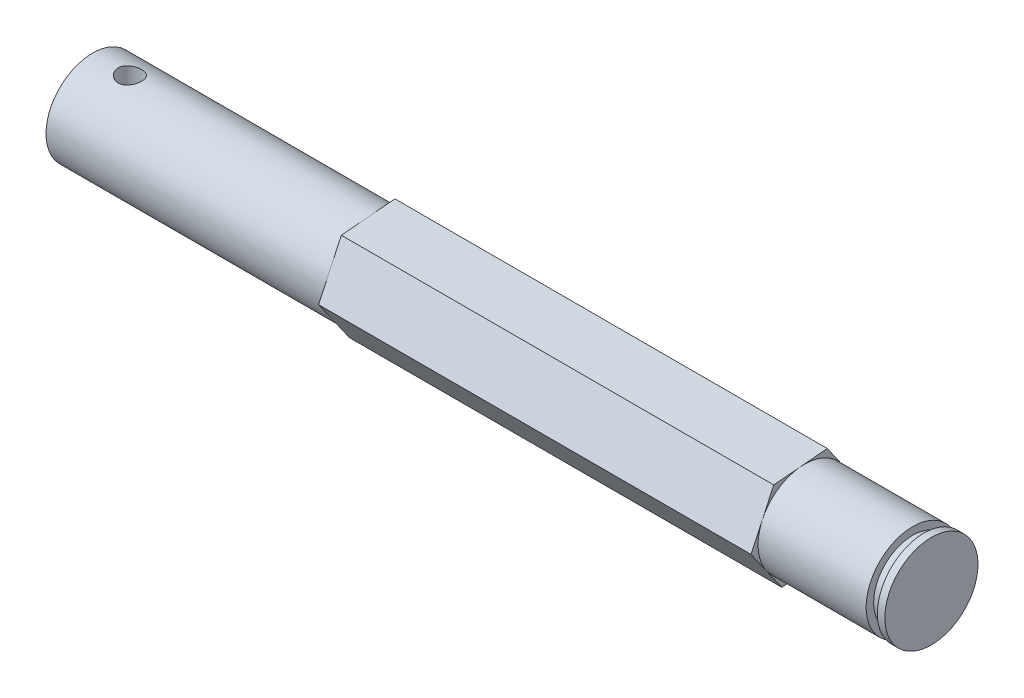
ISO-10303-21;
HEADER;
FILE_DESCRIPTION(('STEP AP214'),'2;1');
FILE_NAME('part.step','',(''),(''),'','','');
FILE_SCHEMA(('AUTOMOTIVE_DESIGN { 1 0 10303 214 1 1 1 1 }'));
ENDSEC;
DATA;
#1=APPLICATION_CONTEXT('core data for automotive mechanical design processes');
#2=APPLICATION_PROTOCOL_DEFINITION('international standard','automotive_design',2000,#1);
#3=PRODUCT_CONTEXT('',#1,'mechanical');
#4=PRODUCT('Part','Part','',(#3));
#5=PRODUCT_RELATED_PRODUCT_CATEGORY('part','',(#4));
#6=PRODUCT_DEFINITION_FORMATION('','',#4);
#7=PRODUCT_DEFINITION_CONTEXT('part definition',#1,'design');
#8=PRODUCT_DEFINITION('design','',#6,#7);
#9=PRODUCT_DEFINITION_SHAPE('','',#8);
#10=(LENGTH_UNIT() NAMED_UNIT(*) SI_UNIT(.MILLI.,.METRE.));
#11=(NAMED_UNIT(*) PLANE_ANGLE_UNIT() SI_UNIT($,.RADIAN.));
#12=(NAMED_UNIT(*) SI_UNIT($,.STERADIAN.) SOLID_ANGLE_UNIT());
#13=UNCERTAINTY_MEASURE_WITH_UNIT(LENGTH_MEASURE(1.E-05),#10,'distance_accuracy_value','');
#14=(GEOMETRIC_REPRESENTATION_CONTEXT(3) GLOBAL_UNCERTAINTY_ASSIGNED_CONTEXT((#13)) GLOBAL_UNIT_ASSIGNED_CONTEXT((#10,
#11,#12)) REPRESENTATION_CONTEXT('',''));
#15=CARTESIAN_POINT('',(0.,0.,0.));
#16=DIRECTION('',(0.,0.,1.));
#17=DIRECTION('',(1.,0.,0.));
#18=AXIS2_PLACEMENT_3D('',#15,#16,#17);
#19=CARTESIAN_POINT('',(29.464,0.,0.));
#20=DIRECTION('',(1.,0.,0.));
#21=DIRECTION('',(0.,0.,-1.));
#22=AXIS2_PLACEMENT_3D('',#19,#20,#21);
#23=CYLINDRICAL_SURFACE('',#22,3.175);
#24=CARTESIAN_POINT('',(29.464,0.,0.));
#25=DIRECTION('',(1.,0.,0.));
#26=DIRECTION('',(0.,0.,-1.));
#27=AXIS2_PLACEMENT_3D('',#24,#25,#26);
#28=CIRCLE('',#27,3.175);
#29=CARTESIAN_POINT('',(29.464,-1.82300798460339,2.5994743484159));
#30=VERTEX_POINT('',#29);
#31=CARTESIAN_POINT('',(29.464,-3.16271481451587,-0.279034051760456));
#32=VERTEX_POINT('',#31);
#33=EDGE_CURVE('E376',#30,#32,#28,.T.);
#34=ORIENTED_EDGE('',*,*,#33,.T.);
#35=CARTESIAN_POINT('',(29.464,-1.33970682991248,-2.87850840017636));
#36=VERTEX_POINT('',#35);
#37=EDGE_CURVE('E378',#32,#36,#28,.T.);
#38=ORIENTED_EDGE('',*,*,#37,.T.);
#39=CARTESIAN_POINT('',(29.464,1.82300798460339,-2.59947434841591));
#40=VERTEX_POINT('',#39);
#41=EDGE_CURVE('E152',#36,#40,#28,.T.);
#42=ORIENTED_EDGE('',*,*,#41,.T.);
#43=CARTESIAN_POINT('',(29.464,3.16271481451587,0.279034051760449));
#44=VERTEX_POINT('',#43);
#45=EDGE_CURVE('E273',#40,#44,#28,.T.);
#46=ORIENTED_EDGE('',*,*,#45,.T.);
#47=CARTESIAN_POINT('',(29.464,1.33970682991248,2.87850840017636));
#48=VERTEX_POINT('',#47);
#49=EDGE_CURVE('E278',#44,#48,#28,.T.);
#50=ORIENTED_EDGE('',*,*,#49,.T.);
#51=EDGE_CURVE('E69',#48,#30,#28,.T.);
#52=ORIENTED_EDGE('',*,*,#51,.T.);
#53=EDGE_LOOP('',(#34,#38,#42,#46,#50,#52));
#54=FACE_BOUND('',#53,.T.);
#55=CARTESIAN_POINT('',(36.83,0.,0.));
#56=DIRECTION('',(1.,0.,0.));
#57=DIRECTION('',(0.,0.,-1.));
#58=AXIS2_PLACEMENT_3D('',#55,#56,#57);
#59=CIRCLE('',#58,3.175);
#60=CARTESIAN_POINT('',(36.83,0.,-3.175));
#61=VERTEX_POINT('',#60);
#62=EDGE_CURVE('E257',#61,#61,#59,.F.);
#63=ORIENTED_EDGE('',*,*,#62,.T.);
#64=EDGE_LOOP('',(#63));
#65=FACE_BOUND('',#64,.T.);
#66=ADVANCED_FACE('F51',(#54,#65),#23,.T.);
#67=CARTESIAN_POINT('',(38.1,-3.32381519941284,1.5469601977703));
#68=DIRECTION('',(0.,0.996130650241218,0.0878847407119546));
#69=DIRECTION('',(0.,-0.0878847407119546,0.996130650241218));
#70=AXIS2_PLACEMENT_3D('',#67,#68,#69);
#71=PLANE('',#70);
#72=DIRECTION('',(0.,0.0878847407119546,-0.996130650241218));
#73=VECTOR('',#72,1.);
#74=CARTESIAN_POINT('',(29.464,-3.32381519941284,1.5469601977703));
#75=LINE('',#74,#73);
#76=CARTESIAN_POINT('',(29.464,-3.32381519941284,1.5469601977703));
#77=VERTEX_POINT('',#76);
#78=EDGE_CURVE('E196',#77,#32,#75,.T.);
#79=ORIENTED_EDGE('',*,*,#78,.F.);
#80=DIRECTION('',(-1.,0.,0.));
#81=VECTOR('',#80,1.);
#82=CARTESIAN_POINT('',(38.1,-3.32381519941284,1.5469601977703));
#83=LINE('',#82,#81);
#84=CARTESIAN_POINT('',(0.,-3.32381519941284,1.5469601977703));
#85=VERTEX_POINT('',#84);
#86=EDGE_CURVE('E321',#77,#85,#83,.T.);
#87=ORIENTED_EDGE('',*,*,#86,.T.);
#88=DIRECTION('',(0.,0.0878847407119546,-0.996130650241218));
#89=VECTOR('',#88,1.);
#90=CARTESIAN_POINT('',(0.,-3.32381519941284,1.5469601977703));
#91=LINE('',#90,#89);
#92=CARTESIAN_POINT('',(0.,-3.16271481451587,-0.279034051760456));
#93=VERTEX_POINT('',#92);
#94=EDGE_CURVE('E296',#85,#93,#91,.T.);
#95=ORIENTED_EDGE('',*,*,#94,.T.);
#96=CARTESIAN_POINT('',(0.,-3.0016144296189,-2.10502830129121));
#97=VERTEX_POINT('',#96);
#98=EDGE_CURVE('E292',#93,#97,#91,.T.);
#99=ORIENTED_EDGE('',*,*,#98,.T.);
#100=DIRECTION('',(-1.,0.,0.));
#101=VECTOR('',#100,1.);
#102=CARTESIAN_POINT('',(38.1,-3.0016144296189,-2.10502830129121));
#103=LINE('',#102,#101);
#104=CARTESIAN_POINT('',(29.464,-3.0016144296189,-2.10502830129121));
#105=VERTEX_POINT('',#104);
#106=EDGE_CURVE('E175',#105,#97,#103,.T.);
#107=ORIENTED_EDGE('',*,*,#106,.F.);
#108=EDGE_CURVE('E287',#32,#105,#75,.T.);
#109=ORIENTED_EDGE('',*,*,#108,.F.);
#110=EDGE_LOOP('',(#79,#87,#95,#99,#107,#109));
#111=FACE_BOUND('',#110,.T.);
#112=ADVANCED_FACE('F53',(#111),#71,.F.);
#113=CARTESIAN_POINT('',(38.1,-3.0016144296189,-2.10502830129121));
#114=DIRECTION('',(0.,0.421954907059048,0.906616818953184));
#115=DIRECTION('',(0.,-0.906616818953184,0.421954907059048));
#116=AXIS2_PLACEMENT_3D('',#113,#114,#115);
#117=PLANE('',#116);
#118=DIRECTION('',(0.,0.906616818953184,-0.421954907059048));
#119=VECTOR('',#118,1.);
#120=CARTESIAN_POINT('',(29.464,-3.0016144296189,-2.10502830129121));
#121=LINE('',#120,#119);
#122=EDGE_CURVE('E158',#105,#36,#121,.T.);
#123=ORIENTED_EDGE('',*,*,#122,.F.);
#124=ORIENTED_EDGE('',*,*,#106,.T.);
#125=DIRECTION('',(0.,0.906616818953184,-0.421954907059048));
#126=VECTOR('',#125,1.);
#127=CARTESIAN_POINT('',(0.,-3.0016144296189,-2.10502830129121));
#128=LINE('',#127,#126);
#129=CARTESIAN_POINT('',(0.,-1.33970682991248,-2.87850840017636));
#130=VERTEX_POINT('',#129);
#131=EDGE_CURVE('E300',#97,#130,#128,.T.);
#132=ORIENTED_EDGE('',*,*,#131,.T.);
#133=CARTESIAN_POINT('',(0.,0.322200769793939,-3.65198849906151));
#134=VERTEX_POINT('',#133);
#135=EDGE_CURVE('E172',#130,#134,#128,.T.);
#136=ORIENTED_EDGE('',*,*,#135,.T.);
#137=DIRECTION('',(-1.,0.,0.));
#138=VECTOR('',#137,1.);
#139=CARTESIAN_POINT('',(38.1,0.322200769793939,-3.65198849906151));
#140=LINE('',#139,#138);
#141=CARTESIAN_POINT('',(29.464,0.322200769793935,-3.65198849906151));
#142=VERTEX_POINT('',#141);
#143=EDGE_CURVE('E164',#142,#134,#140,.T.);
#144=ORIENTED_EDGE('',*,*,#143,.F.);
#145=EDGE_CURVE('E147',#36,#142,#121,.T.);
#146=ORIENTED_EDGE('',*,*,#145,.F.);
#147=EDGE_LOOP('',(#123,#124,#132,#136,#144,#146));
#148=FACE_BOUND('',#147,.T.);
#149=ADVANCED_FACE('F170',(#148),#117,.F.);
#150=CARTESIAN_POINT('',(38.1,0.322200769793939,-3.65198849906151));
#151=DIRECTION('',(0.,-0.574175743182169,0.81873207824123));
#152=DIRECTION('',(0.,-0.81873207824123,-0.574175743182169));
#153=AXIS2_PLACEMENT_3D('',#150,#151,#152);
#154=PLANE('',#153);
#155=DIRECTION('',(0.,0.81873207824123,0.574175743182169));
#156=VECTOR('',#155,1.);
#157=CARTESIAN_POINT('',(29.464,0.322200769793939,-3.65198849906151));
#158=LINE('',#157,#156);
#159=EDGE_CURVE('E150',#142,#40,#158,.T.);
#160=ORIENTED_EDGE('',*,*,#159,.F.);
#161=ORIENTED_EDGE('',*,*,#143,.T.);
#162=DIRECTION('',(0.,0.81873207824123,0.574175743182169));
#163=VECTOR('',#162,1.);
#164=CARTESIAN_POINT('',(0.,0.322200769793939,-3.65198849906151));
#165=LINE('',#164,#163);
#166=CARTESIAN_POINT('',(0.,1.82300798460339,-2.5994743484159));
#167=VERTEX_POINT('',#166);
#168=EDGE_CURVE('E304',#134,#167,#165,.T.);
#169=ORIENTED_EDGE('',*,*,#168,.T.);
#170=CARTESIAN_POINT('',(0.,3.32381519941284,-1.5469601977703));
#171=VERTEX_POINT('',#170);
#172=EDGE_CURVE('E303',#167,#171,#165,.T.);
#173=ORIENTED_EDGE('',*,*,#172,.T.);
#174=DIRECTION('',(-1.,0.,0.));
#175=VECTOR('',#174,1.);
#176=CARTESIAN_POINT('',(38.1,3.32381519941284,-1.5469601977703));
#177=LINE('',#176,#175);
#178=CARTESIAN_POINT('',(29.464,3.32381519941284,-1.54696019777031));
#179=VERTEX_POINT('',#178);
#180=EDGE_CURVE('E176',#179,#171,#177,.T.);
#181=ORIENTED_EDGE('',*,*,#180,.F.);
#182=EDGE_CURVE('E167',#40,#179,#158,.T.);
#183=ORIENTED_EDGE('',*,*,#182,.F.);
#184=EDGE_LOOP('',(#160,#161,#169,#173,#181,#183));
#185=FACE_BOUND('',#184,.T.);
#186=ADVANCED_FACE('F162',(#185),#154,.F.);
#187=CARTESIAN_POINT('',(38.1,3.32381519941284,-1.5469601977703));
#188=DIRECTION('',(0.,-0.996130650241218,-0.0878847407119523));
#189=DIRECTION('',(0.,0.0878847407119523,-0.996130650241219));
#190=AXIS2_PLACEMENT_3D('',#187,#188,#189);
#191=PLANE('',#190);
#192=DIRECTION('',(0.,-0.0878847407119523,0.996130650241219));
#193=VECTOR('',#192,1.);
#194=CARTESIAN_POINT('',(29.464,3.32381519941284,-1.5469601977703));
#195=LINE('',#194,#193);
#196=EDGE_CURVE('E284',#179,#44,#195,.T.);
#197=ORIENTED_EDGE('',*,*,#196,.F.);
#198=ORIENTED_EDGE('',*,*,#180,.T.);
#199=DIRECTION('',(0.,-0.0878847407119523,0.996130650241219));
#200=VECTOR('',#199,1.);
#201=CARTESIAN_POINT('',(0.,3.32381519941284,-1.5469601977703));
#202=LINE('',#201,#200);
#203=CARTESIAN_POINT('',(0.,3.16271481451587,0.279034051760449));
#204=VERTEX_POINT('',#203);
#205=EDGE_CURVE('E308',#171,#204,#202,.T.);
#206=ORIENTED_EDGE('',*,*,#205,.T.);
#207=CARTESIAN_POINT('',(0.,3.0016144296189,2.10502830129121));
#208=VERTEX_POINT('',#207);
#209=EDGE_CURVE('E307',#204,#208,#202,.T.);
#210=ORIENTED_EDGE('',*,*,#209,.T.);
#211=DIRECTION('',(-1.,0.,0.));
#212=VECTOR('',#211,1.);
#213=CARTESIAN_POINT('',(38.1,3.0016144296189,2.10502830129121));
#214=LINE('',#213,#212);
#215=CARTESIAN_POINT('',(29.464,3.0016144296189,2.10502830129121));
#216=VERTEX_POINT('',#215);
#217=EDGE_CURVE('E182',#216,#208,#214,.T.);
#218=ORIENTED_EDGE('',*,*,#217,.F.);
#219=EDGE_CURVE('E282',#44,#216,#195,.T.);
#220=ORIENTED_EDGE('',*,*,#219,.F.);
#221=EDGE_LOOP('',(#197,#198,#206,#210,#218,#220));
#222=FACE_BOUND('',#221,.T.);
#223=ADVANCED_FACE('F340',(#222),#191,.F.);
#224=CARTESIAN_POINT('',(38.1,3.0016144296189,2.10502830129121));
#225=DIRECTION('',(0.,-0.421954907059049,-0.906616818953183));
#226=DIRECTION('',(0.,0.906616818953184,-0.421954907059049));
#227=AXIS2_PLACEMENT_3D('',#224,#225,#226);
#228=PLANE('',#227);
#229=DIRECTION('',(0.,-0.906616818953184,0.421954907059049));
#230=VECTOR('',#229,1.);
#231=CARTESIAN_POINT('',(29.464,3.0016144296189,2.10502830129121));
#232=LINE('',#231,#230);
#233=EDGE_CURVE('E281',#216,#48,#232,.T.);
#234=ORIENTED_EDGE('',*,*,#233,.F.);
#235=ORIENTED_EDGE('',*,*,#217,.T.);
#236=DIRECTION('',(0.,-0.906616818953183,0.421954907059049));
#237=VECTOR('',#236,1.);
#238=CARTESIAN_POINT('',(0.,3.0016144296189,2.10502830129121));
#239=LINE('',#238,#237);
#240=CARTESIAN_POINT('',(0.,1.33970682991248,2.87850840017636));
#241=VERTEX_POINT('',#240);
#242=EDGE_CURVE('E313',#208,#241,#239,.T.);
#243=ORIENTED_EDGE('',*,*,#242,.T.);
#244=CARTESIAN_POINT('',(0.,-0.322200769793939,3.65198849906151));
#245=VERTEX_POINT('',#244);
#246=EDGE_CURVE('E312',#241,#245,#239,.T.);
#247=ORIENTED_EDGE('',*,*,#246,.T.);
#248=DIRECTION('',(-1.,0.,0.));
#249=VECTOR('',#248,1.);
#250=CARTESIAN_POINT('',(38.1,-0.322200769793939,3.65198849906151));
#251=LINE('',#250,#249);
#252=CARTESIAN_POINT('',(29.464,-0.322200769793938,3.65198849906151));
#253=VERTEX_POINT('',#252);
#254=EDGE_CURVE('E324',#253,#245,#251,.T.);
#255=ORIENTED_EDGE('',*,*,#254,.F.);
#256=EDGE_CURVE('E277',#48,#253,#232,.T.);
#257=ORIENTED_EDGE('',*,*,#256,.F.);
#258=EDGE_LOOP('',(#234,#235,#243,#247,#255,#257));
#259=FACE_BOUND('',#258,.T.);
#260=ADVANCED_FACE('F331',(#259),#228,.F.);
#261=CARTESIAN_POINT('',(38.1,-0.322200769793939,3.65198849906151));
#262=DIRECTION('',(0.,0.57417574318217,-0.81873207824123));
#263=DIRECTION('',(0.,0.81873207824123,0.57417574318217));
#264=AXIS2_PLACEMENT_3D('',#261,#262,#263);
#265=PLANE('',#264);
#266=DIRECTION('',(0.,-0.81873207824123,-0.57417574318217));
#267=VECTOR('',#266,1.);
#268=CARTESIAN_POINT('',(29.464,-0.322200769793939,3.65198849906151));
#269=LINE('',#268,#267);
#270=EDGE_CURVE('E14',#253,#30,#269,.T.);
#271=ORIENTED_EDGE('',*,*,#270,.F.);
#272=ORIENTED_EDGE('',*,*,#254,.T.);
#273=DIRECTION('',(0.,-0.81873207824123,-0.57417574318217));
#274=VECTOR('',#273,1.);
#275=CARTESIAN_POINT('',(0.,-0.322200769793939,3.65198849906151));
#276=LINE('',#275,#274);
#277=CARTESIAN_POINT('',(0.,-1.82300798460339,2.5994743484159));
#278=VERTEX_POINT('',#277);
#279=EDGE_CURVE('E317',#245,#278,#276,.T.);
#280=ORIENTED_EDGE('',*,*,#279,.T.);
#281=EDGE_CURVE('E316',#278,#85,#276,.T.);
#282=ORIENTED_EDGE('',*,*,#281,.T.);
#283=ORIENTED_EDGE('',*,*,#86,.F.);
#284=EDGE_CURVE('E61',#30,#77,#269,.T.);
#285=ORIENTED_EDGE('',*,*,#284,.F.);
#286=EDGE_LOOP('',(#271,#272,#280,#282,#283,#285));
#287=FACE_BOUND('',#286,.T.);
#288=ADVANCED_FACE('F393',(#287),#265,.F.);
#289=CARTESIAN_POINT('',(-19.05,0.,0.));
#290=DIRECTION('',(1.,0.,0.));
#291=DIRECTION('',(0.,0.,-1.));
#292=AXIS2_PLACEMENT_3D('',#289,#290,#291);
#293=CYLINDRICAL_SURFACE('',#292,3.175);
#294=CARTESIAN_POINT('',(-19.05,0.,0.));
#295=DIRECTION('',(-1.,0.,0.));
#296=DIRECTION('',(0.,0.,1.));
#297=AXIS2_PLACEMENT_3D('',#294,#295,#296);
#298=CIRCLE('',#297,3.175);
#299=CARTESIAN_POINT('',(-19.05,0.,3.175));
#300=VERTEX_POINT('',#299);
#301=EDGE_CURVE('E290',#300,#300,#298,.T.);
#302=ORIENTED_EDGE('',*,*,#301,.F.);
#303=EDGE_LOOP('',(#302));
#304=FACE_BOUND('',#303,.T.);
#305=CARTESIAN_POINT('',(0.,0.,0.));
#306=DIRECTION('',(-1.,0.,0.));
#307=DIRECTION('',(0.,0.,1.));
#308=AXIS2_PLACEMENT_3D('',#305,#306,#307);
#309=CIRCLE('',#308,3.175);
#310=EDGE_CURVE('E256',#241,#204,#309,.T.);
#311=ORIENTED_EDGE('',*,*,#310,.T.);
#312=EDGE_CURVE('E250',#204,#167,#309,.T.);
#313=ORIENTED_EDGE('',*,*,#312,.T.);
#314=EDGE_CURVE('E254',#167,#130,#309,.T.);
#315=ORIENTED_EDGE('',*,*,#314,.T.);
#316=EDGE_CURVE('E77',#130,#93,#309,.T.);
#317=ORIENTED_EDGE('',*,*,#316,.T.);
#318=EDGE_CURVE('E349',#93,#278,#309,.T.);
#319=ORIENTED_EDGE('',*,*,#318,.T.);
#320=EDGE_CURVE('E180',#278,#241,#309,.T.);
#321=ORIENTED_EDGE('',*,*,#320,.T.);
#322=EDGE_LOOP('',(#311,#313,#315,#317,#319,#321));
#323=FACE_BOUND('',#322,.T.);
#324=CARTESIAN_POINT('',(-16.51,-3.07418053105214,-0.793749999999999));
#325=CARTESIAN_POINT('',(-16.4661688865918,-3.07418136795391,-0.793748754954467));
#326=CARTESIAN_POINT('',(-16.4223239947014,-3.07512817233802,-0.790107082952654));
#327=CARTESIAN_POINT('',(-16.3358932939591,-3.07880341258223,-0.775659842341841));
#328=CARTESIAN_POINT('',(-16.2933082329622,-3.08153288532631,-0.764850104391599));
#329=CARTESIAN_POINT('',(-16.2106598766153,-3.08844545039078,-0.736438455880648));
#330=CARTESIAN_POINT('',(-16.1705934031623,-3.09262666548804,-0.718845313593124));
#331=CARTESIAN_POINT('',(-16.0939763043213,-3.10196925974547,-0.677392962351166));
#332=CARTESIAN_POINT('',(-16.0574258282903,-3.10713068051635,-0.6535334873682));
#333=CARTESIAN_POINT('',(-15.9880739276285,-3.11797927441417,-0.599664925671336));
#334=CARTESIAN_POINT('',(-15.9553612818887,-3.12367484744913,-0.569543211845986));
#335=CARTESIAN_POINT('',(-15.8953957572908,-3.13487712976506,-0.504247805352011));
#336=CARTESIAN_POINT('',(-15.8681433888652,-3.14038382134936,-0.469073640902263));
#337=CARTESIAN_POINT('',(-15.819508789027,-3.15068081927675,-0.394063601342557));
#338=CARTESIAN_POINT('',(-15.7982137717587,-3.15546005749659,-0.354169527941949));
#339=CARTESIAN_POINT('',(-15.7626654379814,-3.16366782786529,-0.271228561012957));
#340=CARTESIAN_POINT('',(-15.7484110825168,-3.16709655928662,-0.228182133738944));
#341=CARTESIAN_POINT('',(-15.7276330625213,-3.1721576093429,-0.141083905904448));
#342=CARTESIAN_POINT('',(-15.7209586379263,-3.17382491295568,-0.097070138456802));
#343=CARTESIAN_POINT('',(-15.71505671458,-3.17529716129069,-0.00851815011593301));
#344=CARTESIAN_POINT('',(-15.7158281148235,-3.17510238135704,0.0360199922658327));
#345=CARTESIAN_POINT('',(-15.7246875149544,-3.17289845147747,0.123310846193078));
#346=CARTESIAN_POINT('',(-15.7326127832046,-3.17092965743227,0.166081246133343));
#347=CARTESIAN_POINT('',(-15.7552933782404,-3.16544590596641,0.24966473388461));
#348=CARTESIAN_POINT('',(-15.7700490686073,-3.16193086624005,0.290477717375281));
#349=CARTESIAN_POINT('',(-15.8061033161931,-3.15368784330034,0.369416570904555));
#350=CARTESIAN_POINT('',(-15.8274597866801,-3.14894918753179,0.407514829627159));
#351=CARTESIAN_POINT('',(-15.8760654281194,-3.13877294459564,0.479643775232759));
#352=CARTESIAN_POINT('',(-15.903315624268,-3.13333523589666,0.513673752849117));
#353=CARTESIAN_POINT('',(-15.9638075255794,-3.12217979121823,0.577670640348681));
#354=CARTESIAN_POINT('',(-15.9971914283204,-3.11645845949479,0.607502657765936));
#355=CARTESIAN_POINT('',(-16.068547991599,-3.10551526316554,0.661174998420643));
#356=CARTESIAN_POINT('',(-16.1065208664884,-3.10029342191146,0.685015041611522));
#357=CARTESIAN_POINT('',(-16.1862420858423,-3.09092757744048,0.726113077411684));
#358=CARTESIAN_POINT('',(-16.2280078443744,-3.08678892332916,0.743338593782825));
#359=CARTESIAN_POINT('',(-16.3139708861143,-3.08012668244436,0.770481711380094));
#360=CARTESIAN_POINT('',(-16.3581676468146,-3.07760275007244,0.780400876451371));
#361=CARTESIAN_POINT('',(-16.4464871417336,-3.07452825542427,0.792425910276192));
#362=CARTESIAN_POINT('',(-16.4905809993821,-3.07392733287233,0.794731225469481));
#363=CARTESIAN_POINT('',(-16.5785234648636,-3.0746298155523,0.792009144488686));
#364=CARTESIAN_POINT('',(-16.6223720948995,-3.07593304548402,0.786982423316994));
#365=CARTESIAN_POINT('',(-16.7078387791231,-3.08024873520573,0.769913834800209));
#366=CARTESIAN_POINT('',(-16.7494815906862,-3.08323288049414,0.757988091679456));
#367=CARTESIAN_POINT('',(-16.8301769878679,-3.0905472805103,0.727588740930425));
#368=CARTESIAN_POINT('',(-16.8692292660001,-3.09487769468935,0.709114357648736));
#369=CARTESIAN_POINT('',(-16.9444801057229,-3.10450273527111,0.66572468706986));
#370=CARTESIAN_POINT('',(-16.9806076567137,-3.10981461032609,0.640690156842815));
#371=CARTESIAN_POINT('',(-17.0482223051894,-3.1207617387527,0.585041607516728));
#372=CARTESIAN_POINT('',(-17.0797086385364,-3.12639704516289,0.55442667150182));
#373=CARTESIAN_POINT('',(-17.1379550060163,-3.13752675462535,0.487571034781629));
#374=CARTESIAN_POINT('',(-17.1645770698592,-3.14301410404633,0.451208737321955));
#375=CARTESIAN_POINT('',(-17.211337137757,-3.15308366274861,0.374414004388902));
#376=CARTESIAN_POINT('',(-17.2314754800231,-3.15766591923757,0.333981781360092));
#377=CARTESIAN_POINT('',(-17.2645216159626,-3.16538011746915,0.250474322624057));
#378=CARTESIAN_POINT('',(-17.2774814102904,-3.16852246032115,0.207420671190885));
#379=CARTESIAN_POINT('',(-17.2959586562382,-3.17304830653163,0.119657622253057));
#380=CARTESIAN_POINT('',(-17.3014775441496,-3.17443214932407,0.0749485460014906));
#381=CARTESIAN_POINT('',(-17.3048355242256,-3.17527121968244,-0.0135600491143869));
#382=CARTESIAN_POINT('',(-17.3028782315945,-3.17477758236007,-0.0573514751542856));
#383=CARTESIAN_POINT('',(-17.2918057870851,-3.1720305531308,-0.143960450279196));
#384=CARTESIAN_POINT('',(-17.2826908480834,-3.16977721355944,-0.186778028288575));
#385=CARTESIAN_POINT('',(-17.2576710505568,-3.16377187327833,-0.270010759543069));
#386=CARTESIAN_POINT('',(-17.2418030089315,-3.16002800573993,-0.310437605073681));
#387=CARTESIAN_POINT('',(-17.2037608529034,-3.15143585574997,-0.388077910851662));
#388=CARTESIAN_POINT('',(-17.1815859435685,-3.14658743409321,-0.425290965254131));
#389=CARTESIAN_POINT('',(-17.1309385330148,-3.13616379434565,-0.496412780686469));
#390=CARTESIAN_POINT('',(-17.1023278865673,-3.13057394700607,-0.53022102196359));
#391=CARTESIAN_POINT('',(-17.0398893612458,-3.11936327685983,-0.592625672340305));
#392=CARTESIAN_POINT('',(-17.0060601615973,-3.11374244655986,-0.621220758022864));
#393=CARTESIAN_POINT('',(-16.9333851274777,-3.10298683964417,-0.672911108517895));
#394=CARTESIAN_POINT('',(-16.8944574770413,-3.09786308710998,-0.695893816685732));
#395=CARTESIAN_POINT('',(-16.8131684548737,-3.088830147179,-0.734954474188649));
#396=CARTESIAN_POINT('',(-16.7708096081523,-3.08492007669321,-0.751037447121647));
#397=CARTESIAN_POINT('',(-16.6921044968629,-3.07936827563419,-0.773447882048921));
#398=CARTESIAN_POINT('',(-16.6561348007715,-3.07743751260823,-0.781044579160438));
#399=CARTESIAN_POINT('',(-16.5834465852301,-3.07484334373159,-0.791195944729675));
#400=CARTESIAN_POINT('',(-16.5467281299261,-3.0741798297732,-0.793751043281599));
#401=CARTESIAN_POINT('',(-16.51,-3.07418053105214,-0.793749999999999));
#402=B_SPLINE_CURVE_WITH_KNOTS('',3,(#324,#325,#326,#327,#328,#329,#330,#331,#332,#333,#334,
#335,#336,#337,#338,#339,#340,#341,#342,#343,#344,#345,#346,#347,#348,#349,#350,#351,#352,#353,
#354,#355,#356,#357,#358,#359,#360,#361,#362,#363,#364,#365,#366,#367,#368,#369,#370,#371,#372,
#373,#374,#375,#376,#377,#378,#379,#380,#381,#382,#383,#384,#385,#386,#387,#388,#389,#390,#391,
#392,#393,#394,#395,#396,#397,#398,#399,#400,#401),.UNSPECIFIED.,.T.,.F.,(4,2,2,2,2,2,2,2,2,2,2,
2,2,2,2,2,2,2,2,2,2,2,2,2,2,2,2,2,2,2,2,2,2,2,2,2,2,2,4),(0.,0.131358462735961,
0.262793397874027,0.394059005845642,0.525330187419071,0.659206054533127,0.793094430669002,
0.928851001033823,1.06458753248494,1.19757428438065,1.33054137198504,1.46055798400783,
1.59058151757162,1.72177987572828,1.85300107383422,1.98777373133624,2.12255268652979,
2.2579851715971,2.39338866038173,2.52521584983887,2.65703090377899,2.78668926087465,
2.91636298048342,3.04858053557324,3.18081983493044,3.31636792578531,3.45190894488,
3.58645483113242,3.72097474275662,3.8518574414251,3.98273624764234,4.1129104830475,
4.2431011331888,4.3764107816185,4.50975422519091,4.64558531534927,4.78131734030944,
4.89139810125845,5.0014694709114),.UNSPECIFIED.);
#403=CARTESIAN_POINT('',(-16.51,-3.07418053105214,-0.793749999999999));
#404=VERTEX_POINT('',#403);
#405=EDGE_CURVE('E186',#404,#404,#402,.T.);
#406=ORIENTED_EDGE('',*,*,#405,.F.);
#407=EDGE_LOOP('',(#406));
#408=FACE_BOUND('',#407,.T.);
#409=CARTESIAN_POINT('',(-16.51,3.07418053105214,-0.793749999999999));
#410=CARTESIAN_POINT('',(-16.5538311134082,3.07418136795391,-0.793748754954467));
#411=CARTESIAN_POINT('',(-16.5976760052986,3.07512817233802,-0.790107082952654));
#412=CARTESIAN_POINT('',(-16.6841067060409,3.07880341258223,-0.775659842341841));
#413=CARTESIAN_POINT('',(-16.7266917670378,3.08153288532631,-0.764850104391599));
#414=CARTESIAN_POINT('',(-16.8093401233847,3.08844545039078,-0.736438455880648));
#415=CARTESIAN_POINT('',(-16.8494065968377,3.09262666548804,-0.718845313593124));
#416=CARTESIAN_POINT('',(-16.9260236956787,3.10196925974547,-0.677392962351167));
#417=CARTESIAN_POINT('',(-16.9625741717097,3.10713068051635,-0.653533487368201));
#418=CARTESIAN_POINT('',(-17.0319260723715,3.11797927441417,-0.599664925671336));
#419=CARTESIAN_POINT('',(-17.0646387181113,3.12367484744913,-0.569543211845986));
#420=CARTESIAN_POINT('',(-17.1246042427092,3.13487712976506,-0.504247805352011));
#421=CARTESIAN_POINT('',(-17.1518566111348,3.14038382134936,-0.469073640902262));
#422=CARTESIAN_POINT('',(-17.200491210973,3.15068081927675,-0.394063601342557));
#423=CARTESIAN_POINT('',(-17.2217862282413,3.15546005749659,-0.354169527941949));
#424=CARTESIAN_POINT('',(-17.2573345620186,3.16366782786529,-0.271228561012957));
#425=CARTESIAN_POINT('',(-17.2715889174832,3.16709655928662,-0.228182133738944));
#426=CARTESIAN_POINT('',(-17.2923669374787,3.1721576093429,-0.141083905904448));
#427=CARTESIAN_POINT('',(-17.2990413620737,3.17382491295568,-0.0970701384568022));
#428=CARTESIAN_POINT('',(-17.30494328542,3.17529716129069,-0.00851815011593314));
#429=CARTESIAN_POINT('',(-17.3041718851765,3.17510238135704,0.0360199922658326));
#430=CARTESIAN_POINT('',(-17.2953124850456,3.17289845147747,0.123310846193078));
#431=CARTESIAN_POINT('',(-17.2873872167954,3.17092965743227,0.166081246133343));
#432=CARTESIAN_POINT('',(-17.2647066217596,3.16544590596641,0.24966473388461));
#433=CARTESIAN_POINT('',(-17.2499509313927,3.16193086624005,0.290477717375281));
#434=CARTESIAN_POINT('',(-17.2138966838069,3.15368784330034,0.369416570904555));
#435=CARTESIAN_POINT('',(-17.1925402133199,3.14894918753179,0.407514829627159));
#436=CARTESIAN_POINT('',(-17.1439345718806,3.13877294459564,0.47964377523276));
#437=CARTESIAN_POINT('',(-17.116684375732,3.13333523589666,0.513673752849117));
#438=CARTESIAN_POINT('',(-17.0561924744206,3.12217979121823,0.57767064034868));
#439=CARTESIAN_POINT('',(-17.0228085716796,3.11645845949479,0.607502657765935));
#440=CARTESIAN_POINT('',(-16.951452008401,3.10551526316554,0.661174998420641));
#441=CARTESIAN_POINT('',(-16.9134791335116,3.10029342191146,0.685015041611522));
#442=CARTESIAN_POINT('',(-16.8337579141577,3.09092757744048,0.726113077411683));
#443=CARTESIAN_POINT('',(-16.7919921556256,3.08678892332916,0.743338593782823));
#444=CARTESIAN_POINT('',(-16.7060291138857,3.08012668244436,0.770481711380093));
#445=CARTESIAN_POINT('',(-16.6618323531854,3.07760275007244,0.780400876451371));
#446=CARTESIAN_POINT('',(-16.5735128582664,3.07452825542427,0.792425910276192));
#447=CARTESIAN_POINT('',(-16.5294190006179,3.07392733287233,0.794731225469481));
#448=CARTESIAN_POINT('',(-16.4414765351364,3.0746298155523,0.792009144488686));
#449=CARTESIAN_POINT('',(-16.3976279051005,3.07593304548402,0.786982423316994));
#450=CARTESIAN_POINT('',(-16.3121612208769,3.08024873520573,0.769913834800209));
#451=CARTESIAN_POINT('',(-16.2705184093138,3.08323288049414,0.757988091679456));
#452=CARTESIAN_POINT('',(-16.1898230121321,3.0905472805103,0.727588740930425));
#453=CARTESIAN_POINT('',(-16.1507707339999,3.09487769468935,0.709114357648736));
#454=CARTESIAN_POINT('',(-16.0755198942771,3.10450273527111,0.66572468706986));
#455=CARTESIAN_POINT('',(-16.0393923432863,3.10981461032609,0.640690156842815));
#456=CARTESIAN_POINT('',(-15.9717776948106,3.1207617387527,0.585041607516728));
#457=CARTESIAN_POINT('',(-15.9402913614636,3.12639704516289,0.55442667150182));
#458=CARTESIAN_POINT('',(-15.8820449939837,3.13752675462535,0.487571034781629));
#459=CARTESIAN_POINT('',(-15.8554229301408,3.14301410404633,0.451208737321955));
#460=CARTESIAN_POINT('',(-15.808662862243,3.15308366274861,0.374414004388902));
#461=CARTESIAN_POINT('',(-15.7885245199769,3.15766591923757,0.333981781360092));
#462=CARTESIAN_POINT('',(-15.7554783840374,3.16538011746915,0.250474322624057));
#463=CARTESIAN_POINT('',(-15.7425185897097,3.16852246032115,0.207420671190885));
#464=CARTESIAN_POINT('',(-15.7240413437618,3.17304830653163,0.119657622253057));
#465=CARTESIAN_POINT('',(-15.7185224558504,3.17443214932407,0.0749485460014906));
#466=CARTESIAN_POINT('',(-15.7151644757744,3.17527121968244,-0.0135600491143869));
#467=CARTESIAN_POINT('',(-15.7171217684055,3.17477758236007,-0.0573514751542856));
#468=CARTESIAN_POINT('',(-15.7281942129149,3.1720305531308,-0.143960450279196));
#469=CARTESIAN_POINT('',(-15.7373091519167,3.16977721355944,-0.186778028288575));
#470=CARTESIAN_POINT('',(-15.7623289494432,3.16377187327833,-0.270010759543069));
#471=CARTESIAN_POINT('',(-15.7781969910685,3.16002800573993,-0.310437605073681));
#472=CARTESIAN_POINT('',(-15.8162391470966,3.15143585574997,-0.388077910851662));
#473=CARTESIAN_POINT('',(-15.8384140564315,3.14658743409321,-0.425290965254131));
#474=CARTESIAN_POINT('',(-15.8890614669852,3.13616379434565,-0.496412780686467));
#475=CARTESIAN_POINT('',(-15.9176721134327,3.13057394700607,-0.530221021963586));
#476=CARTESIAN_POINT('',(-15.9801106387542,3.11936327685983,-0.592625672340302));
#477=CARTESIAN_POINT('',(-16.0139398384027,3.11374244655986,-0.621220758022863));
#478=CARTESIAN_POINT('',(-16.0866148725223,3.10298683964417,-0.672911108517895));
#479=CARTESIAN_POINT('',(-16.1255425229587,3.09786308710998,-0.695893816685732));
#480=CARTESIAN_POINT('',(-16.2068315451263,3.088830147179,-0.734954474188649));
#481=CARTESIAN_POINT('',(-16.2491903918477,3.08492007669321,-0.751037447121647));
#482=CARTESIAN_POINT('',(-16.3278955031371,3.07936827563419,-0.773447882048921));
#483=CARTESIAN_POINT('',(-16.3638651992285,3.07743751260823,-0.781044579160438));
#484=CARTESIAN_POINT('',(-16.4365534147699,3.07484334373159,-0.791195944729675));
#485=CARTESIAN_POINT('',(-16.4732718700739,3.07417982977319,-0.793751043281599));
#486=CARTESIAN_POINT('',(-16.51,3.07418053105214,-0.793749999999999));
#487=B_SPLINE_CURVE_WITH_KNOTS('',3,(#409,#410,#411,#412,#413,#414,#415,#416,#417,#418,#419,
#420,#421,#422,#423,#424,#425,#426,#427,#428,#429,#430,#431,#432,#433,#434,#435,#436,#437,#438,
#439,#440,#441,#442,#443,#444,#445,#446,#447,#448,#449,#450,#451,#452,#453,#454,#455,#456,#457,
#458,#459,#460,#461,#462,#463,#464,#465,#466,#467,#468,#469,#470,#471,#472,#473,#474,#475,#476,
#477,#478,#479,#480,#481,#482,#483,#484,#485,#486),.UNSPECIFIED.,.T.,.F.,(4,2,2,2,2,2,2,2,2,2,2,
2,2,2,2,2,2,2,2,2,2,2,2,2,2,2,2,2,2,2,2,2,2,2,2,2,2,2,4),(0.,0.131358462735961,
0.262793397874027,0.394059005845638,0.525330187419071,0.659206054533127,0.793094430669002,
0.928851001033823,1.06458753248494,1.19757428438065,1.33054137198504,1.46055798400783,
1.59058151757162,1.72177987572828,1.85300107383422,1.98777373133624,2.12255268652979,
2.25798517159709,2.39338866038173,2.52521584983887,2.65703090377899,2.78668926087465,
2.91636298048342,3.04858053557324,3.18081983493044,3.31636792578531,3.45190894488,
3.58645483113242,3.72097474275662,3.8518574414251,3.98273624764234,4.1129104830475,
4.2431011331888,4.37641078161849,4.50975422519091,4.64558531534927,4.78131734030944,
4.89139810125845,5.0014694709114),.UNSPECIFIED.);
#488=CARTESIAN_POINT('',(-16.51,3.07418053105214,-0.793749999999999));
#489=VERTEX_POINT('',#488);
#490=EDGE_CURVE('E195',#489,#489,#487,.T.);
#491=ORIENTED_EDGE('',*,*,#490,.F.);
#492=EDGE_LOOP('',(#491));
#493=FACE_BOUND('',#492,.T.);
#494=ADVANCED_FACE('F201',(#304,#323,#408,#493),#293,.T.);
#495=CARTESIAN_POINT('',(0.,0.,0.));
#496=DIRECTION('',(1.,0.,0.));
#497=DIRECTION('',(0.,0.,-1.));
#498=AXIS2_PLACEMENT_3D('',#495,#496,#497);
#499=PLANE('',#498);
#500=ORIENTED_EDGE('',*,*,#310,.F.);
#501=ORIENTED_EDGE('',*,*,#242,.F.);
#502=ORIENTED_EDGE('',*,*,#209,.F.);
#503=EDGE_LOOP('',(#500,#501,#502));
#504=FACE_BOUND('',#503,.T.);
#505=ADVANCED_FACE('F224',(#504),#499,.F.);
#506=ORIENTED_EDGE('',*,*,#312,.F.);
#507=ORIENTED_EDGE('',*,*,#205,.F.);
#508=ORIENTED_EDGE('',*,*,#172,.F.);
#509=EDGE_LOOP('',(#506,#507,#508));
#510=FACE_BOUND('',#509,.T.);
#511=ADVANCED_FACE('F362',(#510),#499,.F.);
#512=ORIENTED_EDGE('',*,*,#314,.F.);
#513=ORIENTED_EDGE('',*,*,#168,.F.);
#514=ORIENTED_EDGE('',*,*,#135,.F.);
#515=EDGE_LOOP('',(#512,#513,#514));
#516=FACE_BOUND('',#515,.T.);
#517=ADVANCED_FACE('F359',(#516),#499,.F.);
#518=ORIENTED_EDGE('',*,*,#316,.F.);
#519=ORIENTED_EDGE('',*,*,#131,.F.);
#520=ORIENTED_EDGE('',*,*,#98,.F.);
#521=EDGE_LOOP('',(#518,#519,#520));
#522=FACE_BOUND('',#521,.T.);
#523=ADVANCED_FACE('F403',(#522),#499,.F.);
#524=ORIENTED_EDGE('',*,*,#318,.F.);
#525=ORIENTED_EDGE('',*,*,#94,.F.);
#526=ORIENTED_EDGE('',*,*,#281,.F.);
#527=EDGE_LOOP('',(#524,#525,#526));
#528=FACE_BOUND('',#527,.T.);
#529=ADVANCED_FACE('F221',(#528),#499,.F.);
#530=ORIENTED_EDGE('',*,*,#320,.F.);
#531=ORIENTED_EDGE('',*,*,#279,.F.);
#532=ORIENTED_EDGE('',*,*,#246,.F.);
#533=EDGE_LOOP('',(#530,#531,#532));
#534=FACE_BOUND('',#533,.T.);
#535=ADVANCED_FACE('F216',(#534),#499,.F.);
#536=CARTESIAN_POINT('',(-19.05,0.,0.));
#537=DIRECTION('',(-1.,0.,0.));
#538=DIRECTION('',(0.,0.,1.));
#539=AXIS2_PLACEMENT_3D('',#536,#537,#538);
#540=PLANE('',#539);
#541=ORIENTED_EDGE('',*,*,#301,.T.);
#542=EDGE_LOOP('',(#541));
#543=FACE_BOUND('',#542,.T.);
#544=ADVANCED_FACE('F210',(#543),#540,.T.);
#545=CARTESIAN_POINT('',(-16.51,3.32381519941284,0.));
#546=DIRECTION('',(0.,-1.,0.));
#547=DIRECTION('',(0.,0.,-1.));
#548=AXIS2_PLACEMENT_3D('',#545,#546,#547);
#549=CYLINDRICAL_SURFACE('',#548,0.793749999999999);
#550=ORIENTED_EDGE('',*,*,#405,.T.);
#551=EDGE_LOOP('',(#550));
#552=FACE_BOUND('',#551,.T.);
#553=ORIENTED_EDGE('',*,*,#490,.T.);
#554=EDGE_LOOP('',(#553));
#555=FACE_BOUND('',#554,.T.);
#556=ADVANCED_FACE('F205',(#552,#555),#549,.F.);
#557=CARTESIAN_POINT('',(29.464,0.,0.));
#558=DIRECTION('',(1.,0.,0.));
#559=DIRECTION('',(0.,0.,-1.));
#560=AXIS2_PLACEMENT_3D('',#557,#558,#559);
#561=PLANE('',#560);
#562=ORIENTED_EDGE('',*,*,#78,.T.);
#563=ORIENTED_EDGE('',*,*,#33,.F.);
#564=ORIENTED_EDGE('',*,*,#284,.T.);
#565=EDGE_LOOP('',(#562,#563,#564));
#566=FACE_BOUND('',#565,.T.);
#567=ADVANCED_FACE('F209',(#566),#561,.T.);
#568=ORIENTED_EDGE('',*,*,#108,.T.);
#569=ORIENTED_EDGE('',*,*,#122,.T.);
#570=ORIENTED_EDGE('',*,*,#37,.F.);
#571=EDGE_LOOP('',(#568,#569,#570));
#572=FACE_BOUND('',#571,.T.);
#573=ADVANCED_FACE('F401',(#572),#561,.T.);
#574=ORIENTED_EDGE('',*,*,#145,.T.);
#575=ORIENTED_EDGE('',*,*,#159,.T.);
#576=ORIENTED_EDGE('',*,*,#41,.F.);
#577=EDGE_LOOP('',(#574,#575,#576));
#578=FACE_BOUND('',#577,.T.);
#579=ADVANCED_FACE('F149',(#578),#561,.T.);
#580=ORIENTED_EDGE('',*,*,#182,.T.);
#581=ORIENTED_EDGE('',*,*,#196,.T.);
#582=ORIENTED_EDGE('',*,*,#45,.F.);
#583=EDGE_LOOP('',(#580,#581,#582));
#584=FACE_BOUND('',#583,.T.);
#585=ADVANCED_FACE('F383',(#584),#561,.T.);
#586=ORIENTED_EDGE('',*,*,#219,.T.);
#587=ORIENTED_EDGE('',*,*,#233,.T.);
#588=ORIENTED_EDGE('',*,*,#49,.F.);
#589=EDGE_LOOP('',(#586,#587,#588));
#590=FACE_BOUND('',#589,.T.);
#591=ADVANCED_FACE('F386',(#590),#561,.T.);
#592=ORIENTED_EDGE('',*,*,#256,.T.);
#593=ORIENTED_EDGE('',*,*,#270,.T.);
#594=ORIENTED_EDGE('',*,*,#51,.F.);
#595=EDGE_LOOP('',(#592,#593,#594));
#596=FACE_BOUND('',#595,.T.);
#597=ADVANCED_FACE('F390',(#596),#561,.T.);
#598=CARTESIAN_POINT('',(37.592,0.,0.));
#599=DIRECTION('',(1.,0.,0.));
#600=DIRECTION('',(0.,0.,-1.));
#601=AXIS2_PLACEMENT_3D('',#598,#599,#600);
#602=PLANE('',#601);
#603=CARTESIAN_POINT('',(37.592,0.,0.));
#604=DIRECTION('',(1.,0.,0.));
#605=DIRECTION('',(0.,0.,-1.));
#606=AXIS2_PLACEMENT_3D('',#603,#604,#605);
#607=CIRCLE('',#606,3.175);
#608=CARTESIAN_POINT('',(37.592,0.,-3.175));
#609=VERTEX_POINT('',#608);
#610=EDGE_CURVE('E55',#609,#609,#607,.F.);
#611=ORIENTED_EDGE('',*,*,#610,.T.);
#612=EDGE_LOOP('',(#611));
#613=FACE_BOUND('',#612,.T.);
#614=CARTESIAN_POINT('',(37.592,0.,0.));
#615=DIRECTION('',(1.,0.,0.));
#616=DIRECTION('',(0.,0.,-1.));
#617=AXIS2_PLACEMENT_3D('',#614,#615,#616);
#618=CIRCLE('',#617,2.667);
#619=CARTESIAN_POINT('',(37.592,0.,2.667));
#620=VERTEX_POINT('',#619);
#621=EDGE_CURVE('E260',#620,#620,#618,.T.);
#622=ORIENTED_EDGE('',*,*,#621,.T.);
#623=EDGE_LOOP('',(#622));
#624=FACE_BOUND('',#623,.T.);
#625=ADVANCED_FACE('F711',(#613,#624),#602,.F.);
#626=CARTESIAN_POINT('',(36.83,0.,0.));
#627=DIRECTION('',(1.,0.,0.));
#628=DIRECTION('',(0.,0.,-1.));
#629=AXIS2_PLACEMENT_3D('',#626,#627,#628);
#630=PLANE('',#629);
#631=ORIENTED_EDGE('',*,*,#62,.F.);
#632=EDGE_LOOP('',(#631));
#633=FACE_BOUND('',#632,.T.);
#634=CARTESIAN_POINT('',(36.83,0.,0.));
#635=DIRECTION('',(1.,0.,0.));
#636=DIRECTION('',(0.,0.,-1.));
#637=AXIS2_PLACEMENT_3D('',#634,#635,#636);
#638=CIRCLE('',#637,2.667);
#639=CARTESIAN_POINT('',(36.83,0.,2.667));
#640=VERTEX_POINT('',#639);
#641=EDGE_CURVE('E265',#640,#640,#638,.T.);
#642=ORIENTED_EDGE('',*,*,#641,.F.);
#643=EDGE_LOOP('',(#642));
#644=FACE_BOUND('',#643,.T.);
#645=ADVANCED_FACE('F758',(#633,#644),#630,.T.);
#646=CARTESIAN_POINT('',(37.592,0.,0.));
#647=DIRECTION('',(-1.,0.,0.));
#648=DIRECTION('',(0.,0.,1.));
#649=AXIS2_PLACEMENT_3D('',#646,#647,#648);
#650=CYLINDRICAL_SURFACE('',#649,2.667);
#651=CARTESIAN_POINT('',(37.592,0.,2.667));
#652=CARTESIAN_POINT('',(37.5840625,0.,2.667));
#653=CARTESIAN_POINT('',(37.576125,0.,2.667));
#654=CARTESIAN_POINT('',(37.56025,0.,2.667));
#655=CARTESIAN_POINT('',(37.5523125,0.,2.667));
#656=CARTESIAN_POINT('',(37.5364375,0.,2.667));
#657=CARTESIAN_POINT('',(37.5285,0.,2.667));
#658=CARTESIAN_POINT('',(37.512625,0.,2.667));
#659=CARTESIAN_POINT('',(37.5046875,0.,2.667));
#660=CARTESIAN_POINT('',(37.4888125,0.,2.667));
#661=CARTESIAN_POINT('',(37.480875,0.,2.667));
#662=CARTESIAN_POINT('',(37.465,0.,2.667));
#663=CARTESIAN_POINT('',(37.4570625,0.,2.667));
#664=CARTESIAN_POINT('',(37.4411875,0.,2.667));
#665=CARTESIAN_POINT('',(37.43325,0.,2.667));
#666=CARTESIAN_POINT('',(37.417375,0.,2.667));
#667=CARTESIAN_POINT('',(37.4094375,0.,2.667));
#668=CARTESIAN_POINT('',(37.3935625,0.,2.667));
#669=CARTESIAN_POINT('',(37.385625,0.,2.667));
#670=CARTESIAN_POINT('',(37.36975,0.,2.667));
#671=CARTESIAN_POINT('',(37.3618125,0.,2.667));
#672=CARTESIAN_POINT('',(37.3459375,0.,2.667));
#673=CARTESIAN_POINT('',(37.338,0.,2.667));
#674=CARTESIAN_POINT('',(37.322125,0.,2.667));
#675=CARTESIAN_POINT('',(37.3141875,0.,2.667));
#676=CARTESIAN_POINT('',(37.2983125,0.,2.667));
#677=CARTESIAN_POINT('',(37.290375,0.,2.667));
#678=CARTESIAN_POINT('',(37.2745,0.,2.667));
#679=CARTESIAN_POINT('',(37.2665625,0.,2.667));
#680=CARTESIAN_POINT('',(37.2506875,0.,2.667));
#681=CARTESIAN_POINT('',(37.24275,0.,2.667));
#682=CARTESIAN_POINT('',(37.226875,0.,2.667));
#683=CARTESIAN_POINT('',(37.2189375,0.,2.667));
#684=CARTESIAN_POINT('',(37.2030625,0.,2.667));
#685=CARTESIAN_POINT('',(37.195125,0.,2.667));
#686=CARTESIAN_POINT('',(37.17925,0.,2.667));
#687=CARTESIAN_POINT('',(37.1713125,0.,2.667));
#688=CARTESIAN_POINT('',(37.1554375,0.,2.667));
#689=CARTESIAN_POINT('',(37.1475,0.,2.667));
#690=CARTESIAN_POINT('',(37.131625,0.,2.667));
#691=CARTESIAN_POINT('',(37.1236875,0.,2.667));
#692=CARTESIAN_POINT('',(37.1078125,0.,2.667));
#693=CARTESIAN_POINT('',(37.099875,0.,2.667));
#694=CARTESIAN_POINT('',(37.084,0.,2.667));
#695=CARTESIAN_POINT('',(37.0760625,0.,2.667));
#696=CARTESIAN_POINT('',(37.0601875,0.,2.667));
#697=CARTESIAN_POINT('',(37.05225,0.,2.667));
#698=CARTESIAN_POINT('',(37.036375,0.,2.667));
#699=CARTESIAN_POINT('',(37.0284375,0.,2.667));
#700=CARTESIAN_POINT('',(37.0125625,0.,2.667));
#701=CARTESIAN_POINT('',(37.004625,0.,2.667));
#702=CARTESIAN_POINT('',(36.98875,0.,2.667));
#703=CARTESIAN_POINT('',(36.9808125,0.,2.667));
#704=CARTESIAN_POINT('',(36.9649375,0.,2.667));
#705=CARTESIAN_POINT('',(36.957,0.,2.667));
#706=CARTESIAN_POINT('',(36.941125,0.,2.667));
#707=CARTESIAN_POINT('',(36.9331875,0.,2.667));
#708=CARTESIAN_POINT('',(36.9173125,0.,2.667));
#709=CARTESIAN_POINT('',(36.909375,0.,2.667));
#710=CARTESIAN_POINT('',(36.8935,0.,2.667));
#711=CARTESIAN_POINT('',(36.8855625,0.,2.667));
#712=CARTESIAN_POINT('',(36.8696875,0.,2.667));
#713=CARTESIAN_POINT('',(36.86175,0.,2.667));
#714=CARTESIAN_POINT('',(36.845875,0.,2.667));
#715=CARTESIAN_POINT('',(36.8379375,0.,2.667));
#716=CARTESIAN_POINT('',(36.83,0.,2.667));
#717=B_SPLINE_CURVE_WITH_KNOTS('',3,(#651,#652,#653,#654,#655,#656,#657,#658,#659,#660,#661,
#662,#663,#664,#665,#666,#667,#668,#669,#670,#671,#672,#673,#674,#675,#676,#677,#678,#679,#680,
#681,#682,#683,#684,#685,#686,#687,#688,#689,#690,#691,#692,#693,#694,#695,#696,#697,#698,#699,
#700,#701,#702,#703,#704,#705,#706,#707,#708,#709,#710,#711,#712,#713,#714,#715,#716),
.UNSPECIFIED.,.F.,.F.,(4,2,2,2,2,2,2,2,2,2,2,2,2,2,2,2,2,2,2,2,2,2,2,2,2,2,2,2,2,2,2,2,4),(0.,
0.0238124999999978,0.0476249999999956,0.0714374999999934,0.0952499999999981,0.119062499999996,
0.142874999999994,0.166687499999998,0.190499999999996,0.214312499999994,0.238124999999999,
0.261937499999997,0.285749999999994,0.309562499999999,0.333374999999997,0.357187499999995,
0.380999999999999,0.404812499999997,0.428624999999995,0.452437499999993,0.476249999999998,
0.500062499999995,0.523874999999993,0.547687499999998,0.571499999999996,0.595312499999993,
0.619124999999998,0.642937499999996,0.666749999999994,0.690562499999998,0.714374999999996,
0.738187499999994,0.761999999999999),.UNSPECIFIED.);
#718=EDGE_CURVE('BSEAM241',#620,#640,#717,.T.);
#719=ORIENTED_EDGE('',*,*,#621,.F.);
#720=ORIENTED_EDGE('',*,*,#641,.T.);
#721=ORIENTED_EDGE('',*,*,#718,.T.);
#722=ORIENTED_EDGE('',*,*,#718,.F.);
#723=EDGE_LOOP('',(#719,#721,#720,#722));
#724=FACE_BOUND('',#723,.T.);
#725=ADVANCED_FACE('F241',(#724),#650,.T.);
#726=CARTESIAN_POINT('',(38.1,0.,0.));
#727=DIRECTION('',(1.,0.,0.));
#728=DIRECTION('',(0.,0.,-1.));
#729=AXIS2_PLACEMENT_3D('',#726,#727,#728);
#730=PLANE('',#729);
#731=CARTESIAN_POINT('',(38.1,0.,0.));
#732=DIRECTION('',(1.,0.,0.));
#733=DIRECTION('',(0.,0.,-1.));
#734=AXIS2_PLACEMENT_3D('',#731,#732,#733);
#735=CIRCLE('',#734,3.175);
#736=CARTESIAN_POINT('',(38.1,0.,-3.175));
#737=VERTEX_POINT('',#736);
#738=EDGE_CURVE('E248',#737,#737,#735,.T.);
#739=ORIENTED_EDGE('',*,*,#738,.T.);
#740=EDGE_LOOP('',(#739));
#741=FACE_BOUND('',#740,.T.);
#742=ADVANCED_FACE('F235',(#741),#730,.T.);
#743=ORIENTED_EDGE('',*,*,#610,.F.);
#744=EDGE_LOOP('',(#743));
#745=FACE_BOUND('',#744,.T.);
#746=ORIENTED_EDGE('',*,*,#738,.F.);
#747=EDGE_LOOP('',(#746));
#748=FACE_BOUND('',#747,.T.);
#749=ADVANCED_FACE('F212',(#745,#748),#23,.T.);
#750=CLOSED_SHELL('',(#66,#112,#149,#186,#223,#260,#288,#494,#505,#511,#517,#523,#529,#535,#544,
#556,#567,#573,#579,#585,#591,#597,#625,#645,#725,#742,#749));
#751=MANIFOLD_SOLID_BREP('B2',#750);
#752=ADVANCED_BREP_SHAPE_REPRESENTATION('',(#18,#751),#14);
#753=SHAPE_DEFINITION_REPRESENTATION(#9,#752);
ENDSEC;
END-ISO-10303-21;
